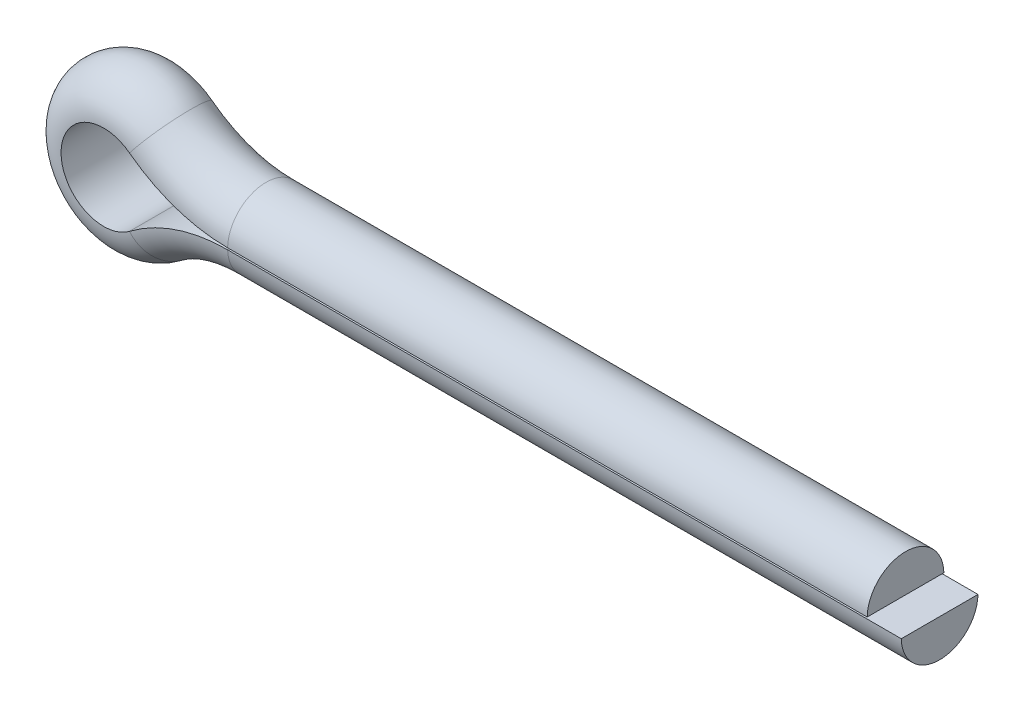
ISO-10303-21;
HEADER;
FILE_DESCRIPTION(('STEP AP214'),'2;1');
FILE_NAME('part.step','',(''),(''),'','','');
FILE_SCHEMA(('AUTOMOTIVE_DESIGN { 1 0 10303 214 1 1 1 1 }'));
ENDSEC;
DATA;
#1=APPLICATION_CONTEXT('core data for automotive mechanical design processes');
#2=APPLICATION_PROTOCOL_DEFINITION('international standard','automotive_design',2000,#1);
#3=PRODUCT_CONTEXT('',#1,'mechanical');
#4=PRODUCT('Part','Part','',(#3));
#5=PRODUCT_RELATED_PRODUCT_CATEGORY('part','',(#4));
#6=PRODUCT_DEFINITION_FORMATION('','',#4);
#7=PRODUCT_DEFINITION_CONTEXT('part definition',#1,'design');
#8=PRODUCT_DEFINITION('design','',#6,#7);
#9=PRODUCT_DEFINITION_SHAPE('','',#8);
#10=(LENGTH_UNIT() NAMED_UNIT(*) SI_UNIT(.MILLI.,.METRE.));
#11=(NAMED_UNIT(*) PLANE_ANGLE_UNIT() SI_UNIT($,.RADIAN.));
#12=(NAMED_UNIT(*) SI_UNIT($,.STERADIAN.) SOLID_ANGLE_UNIT());
#13=UNCERTAINTY_MEASURE_WITH_UNIT(LENGTH_MEASURE(1.E-05),#10,'distance_accuracy_value','');
#14=(GEOMETRIC_REPRESENTATION_CONTEXT(3) GLOBAL_UNCERTAINTY_ASSIGNED_CONTEXT((#13)) GLOBAL_UNIT_ASSIGNED_CONTEXT((#10,
#11,#12)) REPRESENTATION_CONTEXT('',''));
#15=CARTESIAN_POINT('',(0.,0.,0.));
#16=DIRECTION('',(0.,0.,1.));
#17=DIRECTION('',(1.,0.,0.));
#18=AXIS2_PLACEMENT_3D('',#15,#16,#17);
#19=CARTESIAN_POINT('',(0.,0.,0.));
#20=DIRECTION('',(1.,0.,0.));
#21=DIRECTION('',(0.,0.,-1.));
#22=AXIS2_PLACEMENT_3D('',#19,#20,#21);
#23=PLANE('',#22);
#24=CARTESIAN_POINT('',(0.,0.,0.));
#25=DIRECTION('',(1.,0.,0.));
#26=DIRECTION('',(0.,0.,-1.));
#27=AXIS2_PLACEMENT_3D('',#24,#25,#26);
#28=CIRCLE('',#27,1.143);
#29=CARTESIAN_POINT('',(0.,0.0253999999999999,-1.14271774292692));
#30=VERTEX_POINT('',#29);
#31=CARTESIAN_POINT('',(0.,0.0254,1.14271774292692));
#32=VERTEX_POINT('',#31);
#33=EDGE_CURVE('E88',#30,#32,#28,.T.);
#34=ORIENTED_EDGE('',*,*,#33,.T.);
#35=DIRECTION('',(0.,0.,-1.));
#36=VECTOR('',#35,1.);
#37=CARTESIAN_POINT('',(0.,0.0254,1.14271774292692));
#38=LINE('',#37,#36);
#39=EDGE_CURVE('E97',#32,#30,#38,.T.);
#40=ORIENTED_EDGE('',*,*,#39,.T.);
#41=EDGE_LOOP('',(#34,#40));
#42=FACE_BOUND('',#41,.T.);
#43=ADVANCED_FACE('F37',(#42),#23,.T.);
#44=CARTESIAN_POINT('',(1.01599999999998,0.,0.));
#45=DIRECTION('',(-1.,0.,0.));
#46=DIRECTION('',(0.,0.,-1.));
#47=AXIS2_PLACEMENT_3D('',#44,#45,#46);
#48=PLANE('',#47);
#49=CARTESIAN_POINT('',(1.01599999999998,0.,0.));
#50=DIRECTION('',(-1.,0.,0.));
#51=DIRECTION('',(0.,0.,-1.));
#52=AXIS2_PLACEMENT_3D('',#49,#50,#51);
#53=CIRCLE('',#52,1.143);
#54=CARTESIAN_POINT('',(1.01599999999998,-0.0253999999999999,-1.14271774292692));
#55=VERTEX_POINT('',#54);
#56=CARTESIAN_POINT('',(1.01599999999998,-0.0254,1.14271774292692));
#57=VERTEX_POINT('',#56);
#58=EDGE_CURVE('E51',#55,#57,#53,.T.);
#59=ORIENTED_EDGE('',*,*,#58,.F.);
#60=DIRECTION('',(0.,0.,-1.));
#61=VECTOR('',#60,1.);
#62=CARTESIAN_POINT('',(1.01599999999998,-0.0254,1.14271774292692));
#63=LINE('',#62,#61);
#64=EDGE_CURVE('E11',#57,#55,#63,.T.);
#65=ORIENTED_EDGE('',*,*,#64,.F.);
#66=EDGE_LOOP('',(#59,#65));
#67=FACE_BOUND('',#66,.T.);
#68=ADVANCED_FACE('F188',(#67),#48,.F.);
#69=CARTESIAN_POINT('',(0.,0.,0.));
#70=DIRECTION('',(-1.,0.,0.));
#71=DIRECTION('',(0.,-1.,0.));
#72=AXIS2_PLACEMENT_3D('',#69,#70,#71);
#73=CYLINDRICAL_SURFACE('',#72,1.143);
#74=DIRECTION('',(-1.,0.,0.));
#75=VECTOR('',#74,1.);
#76=CARTESIAN_POINT('',(0.,0.0254,1.14271774292692));
#77=LINE('',#76,#75);
#78=CARTESIAN_POINT('',(-19.05,0.0253999999999949,1.14271774292692));
#79=VERTEX_POINT('',#78);
#80=EDGE_CURVE('E95',#32,#79,#77,.T.);
#81=ORIENTED_EDGE('',*,*,#80,.F.);
#82=ORIENTED_EDGE('',*,*,#33,.F.);
#83=DIRECTION('',(-1.,0.,0.));
#84=VECTOR('',#83,1.);
#85=CARTESIAN_POINT('',(0.,0.0253999999999999,-1.14271774292692));
#86=LINE('',#85,#84);
#87=CARTESIAN_POINT('',(-19.05,0.0253999999999948,-1.14271774292692));
#88=VERTEX_POINT('',#87);
#89=EDGE_CURVE('E93',#30,#88,#86,.T.);
#90=ORIENTED_EDGE('',*,*,#89,.T.);
#91=CARTESIAN_POINT('',(-19.05,0.,0.));
#92=DIRECTION('',(1.,0.,0.));
#93=DIRECTION('',(0.,0.,-1.));
#94=AXIS2_PLACEMENT_3D('',#91,#92,#93);
#95=CIRCLE('',#94,1.143);
#96=EDGE_CURVE('E106',#88,#79,#95,.T.);
#97=ORIENTED_EDGE('',*,*,#96,.T.);
#98=EDGE_LOOP('',(#81,#82,#90,#97));
#99=FACE_BOUND('',#98,.T.);
#100=ADVANCED_FACE('F90',(#99),#73,.T.);
#101=CARTESIAN_POINT('',(0.,0.0254,1.14271774292692));
#102=DIRECTION('',(0.,1.,0.));
#103=DIRECTION('',(-1.,0.,0.));
#104=AXIS2_PLACEMENT_3D('',#101,#102,#103);
#105=PLANE('',#104);
#106=DIRECTION('',(0.,0.,-1.));
#107=VECTOR('',#106,1.);
#108=CARTESIAN_POINT('',(-19.05,0.0253999999999949,1.14271774292692));
#109=LINE('',#108,#107);
#110=EDGE_CURVE('E104',#79,#88,#109,.T.);
#111=ORIENTED_EDGE('',*,*,#110,.T.);
#112=ORIENTED_EDGE('',*,*,#89,.F.);
#113=ORIENTED_EDGE('',*,*,#39,.F.);
#114=ORIENTED_EDGE('',*,*,#80,.T.);
#115=EDGE_LOOP('',(#111,#112,#113,#114));
#116=FACE_BOUND('',#115,.T.);
#117=ADVANCED_FACE('F102',(#116),#105,.F.);
#118=CARTESIAN_POINT('',(-19.05,4.8514,0.));
#119=DIRECTION('',(0.,0.,-1.));
#120=DIRECTION('',(-1.,0.,0.));
#121=AXIS2_PLACEMENT_3D('',#118,#119,#120);
#122=TOROIDAL_SURFACE('',#121,4.8514,1.143);
#123=CARTESIAN_POINT('',(-19.05,4.8514,1.14271774292692));
#124=DIRECTION('',(0.,0.,-1.));
#125=DIRECTION('',(0.,-1.,0.));
#126=AXIS2_PLACEMENT_3D('',#123,#124,#125);
#127=CIRCLE('',#126,4.826);
#128=CARTESIAN_POINT('',(-21.9722189379986,1.01070833333334,1.14271774292692));
#129=VERTEX_POINT('',#128);
#130=EDGE_CURVE('E114',#79,#129,#127,.T.);
#131=ORIENTED_EDGE('',*,*,#130,.F.);
#132=ORIENTED_EDGE('',*,*,#96,.F.);
#133=CARTESIAN_POINT('',(-19.05,4.8514,-1.14271774292692));
#134=DIRECTION('',(0.,0.,-1.));
#135=DIRECTION('',(0.,-1.,0.));
#136=AXIS2_PLACEMENT_3D('',#133,#134,#135);
#137=CIRCLE('',#136,4.826);
#138=CARTESIAN_POINT('',(-21.9722189379986,1.01070833333334,-1.14271774292692));
#139=VERTEX_POINT('',#138);
#140=EDGE_CURVE('E115',#88,#139,#137,.T.);
#141=ORIENTED_EDGE('',*,*,#140,.T.);
#142=CARTESIAN_POINT('',(-21.9875990376722,0.990494166666675,0.));
#143=DIRECTION('',(0.79583333333333,-0.605515735184116,0.));
#144=DIRECTION('',(0.,0.,-1.));
#145=AXIS2_PLACEMENT_3D('',#142,#143,#144);
#146=CIRCLE('',#145,1.143);
#147=EDGE_CURVE('E111',#139,#129,#146,.T.);
#148=ORIENTED_EDGE('',*,*,#147,.T.);
#149=EDGE_LOOP('',(#131,#132,#141,#148));
#150=FACE_BOUND('',#149,.T.);
#151=ADVANCED_FACE('F168',(#150),#122,.T.);
#152=CARTESIAN_POINT('',(-19.05,4.8514,0.));
#153=DIRECTION('',(0.,0.,-1.));
#154=DIRECTION('',(-1.,0.,0.));
#155=AXIS2_PLACEMENT_3D('',#152,#153,#154);
#156=CYLINDRICAL_SURFACE('',#155,4.826);
#157=DIRECTION('',(0.,0.,-1.));
#158=VECTOR('',#157,1.);
#159=CARTESIAN_POINT('',(-21.9722189379986,1.01070833333334,1.14271774292692));
#160=LINE('',#159,#158);
#161=EDGE_CURVE('E118',#129,#139,#160,.T.);
#162=ORIENTED_EDGE('',*,*,#161,.T.);
#163=ORIENTED_EDGE('',*,*,#140,.F.);
#164=ORIENTED_EDGE('',*,*,#110,.F.);
#165=ORIENTED_EDGE('',*,*,#130,.T.);
#166=EDGE_LOOP('',(#162,#163,#164,#165));
#167=FACE_BOUND('',#166,.T.);
#168=ADVANCED_FACE('F166',(#167),#156,.T.);
#169=CARTESIAN_POINT('',(-22.7412239216824,0.,0.));
#170=DIRECTION('',(0.,0.,1.));
#171=DIRECTION('',(1.,0.,0.));
#172=AXIS2_PLACEMENT_3D('',#169,#170,#171);
#173=TOROIDAL_SURFACE('',#172,1.2446,1.143);
#174=CARTESIAN_POINT('',(-22.7412239216824,0.,1.14271774292692));
#175=DIRECTION('',(0.,0.,1.));
#176=DIRECTION('',(0.605515735184106,0.795833333333338,0.));
#177=AXIS2_PLACEMENT_3D('',#174,#175,#176);
#178=CIRCLE('',#177,1.27);
#179=CARTESIAN_POINT('',(-21.9722189379986,-1.01070833333333,1.14271774292692));
#180=VERTEX_POINT('',#179);
#181=EDGE_CURVE('E124',#129,#180,#178,.T.);
#182=ORIENTED_EDGE('',*,*,#181,.F.);
#183=ORIENTED_EDGE('',*,*,#147,.F.);
#184=CARTESIAN_POINT('',(-22.7412239216824,0.,-1.14271774292692));
#185=DIRECTION('',(0.,0.,1.));
#186=DIRECTION('',(0.605515735184106,0.795833333333338,0.));
#187=AXIS2_PLACEMENT_3D('',#184,#185,#186);
#188=CIRCLE('',#187,1.27);
#189=CARTESIAN_POINT('',(-21.9722189379986,-1.01070833333333,-1.14271774292692));
#190=VERTEX_POINT('',#189);
#191=EDGE_CURVE('E125',#139,#190,#188,.T.);
#192=ORIENTED_EDGE('',*,*,#191,.T.);
#193=CARTESIAN_POINT('',(-21.9875990376722,-0.990494166666666,0.));
#194=DIRECTION('',(-0.795833333333334,-0.605515735184111,0.));
#195=DIRECTION('',(0.,0.,-1.));
#196=AXIS2_PLACEMENT_3D('',#193,#194,#195);
#197=CIRCLE('',#196,1.143);
#198=EDGE_CURVE('E121',#190,#180,#197,.T.);
#199=ORIENTED_EDGE('',*,*,#198,.T.);
#200=EDGE_LOOP('',(#182,#183,#192,#199));
#201=FACE_BOUND('',#200,.T.);
#202=ADVANCED_FACE('F161',(#201),#173,.T.);
#203=CARTESIAN_POINT('',(-22.7412239216824,0.,0.));
#204=DIRECTION('',(0.,0.,1.));
#205=DIRECTION('',(1.,0.,0.));
#206=AXIS2_PLACEMENT_3D('',#203,#204,#205);
#207=CYLINDRICAL_SURFACE('',#206,1.27);
#208=DIRECTION('',(0.,0.,-1.));
#209=VECTOR('',#208,1.);
#210=CARTESIAN_POINT('',(-21.9722189379986,-1.01070833333333,1.14271774292692));
#211=LINE('',#210,#209);
#212=EDGE_CURVE('E128',#180,#190,#211,.T.);
#213=ORIENTED_EDGE('',*,*,#212,.T.);
#214=ORIENTED_EDGE('',*,*,#191,.F.);
#215=ORIENTED_EDGE('',*,*,#161,.F.);
#216=ORIENTED_EDGE('',*,*,#181,.T.);
#217=EDGE_LOOP('',(#213,#214,#215,#216));
#218=FACE_BOUND('',#217,.T.);
#219=ADVANCED_FACE('F164',(#218),#207,.F.);
#220=CARTESIAN_POINT('',(-19.05,-4.8514,0.));
#221=DIRECTION('',(0.,0.,-1.));
#222=DIRECTION('',(-1.,0.,0.));
#223=AXIS2_PLACEMENT_3D('',#220,#221,#222);
#224=TOROIDAL_SURFACE('',#223,4.8514,1.143);
#225=CARTESIAN_POINT('',(-19.05,-4.8514,1.14271774292692));
#226=DIRECTION('',(0.,0.,-1.));
#227=DIRECTION('',(-0.605515735184111,0.795833333333334,0.));
#228=AXIS2_PLACEMENT_3D('',#225,#226,#227);
#229=CIRCLE('',#228,4.826);
#230=CARTESIAN_POINT('',(-19.05,-0.0254000000000035,1.14271774292692));
#231=VERTEX_POINT('',#230);
#232=EDGE_CURVE('E134',#180,#231,#229,.T.);
#233=ORIENTED_EDGE('',*,*,#232,.F.);
#234=ORIENTED_EDGE('',*,*,#198,.F.);
#235=CARTESIAN_POINT('',(-19.05,-4.8514,-1.14271774292692));
#236=DIRECTION('',(0.,0.,-1.));
#237=DIRECTION('',(-0.605515735184111,0.795833333333334,0.));
#238=AXIS2_PLACEMENT_3D('',#235,#236,#237);
#239=CIRCLE('',#238,4.826);
#240=CARTESIAN_POINT('',(-19.05,-0.0254000000000035,-1.14271774292692));
#241=VERTEX_POINT('',#240);
#242=EDGE_CURVE('E135',#190,#241,#239,.T.);
#243=ORIENTED_EDGE('',*,*,#242,.T.);
#244=CARTESIAN_POINT('',(-19.05,0.,0.));
#245=DIRECTION('',(-1.,0.,0.));
#246=DIRECTION('',(0.,0.,-1.));
#247=AXIS2_PLACEMENT_3D('',#244,#245,#246);
#248=CIRCLE('',#247,1.143);
#249=EDGE_CURVE('E131',#241,#231,#248,.T.);
#250=ORIENTED_EDGE('',*,*,#249,.T.);
#251=EDGE_LOOP('',(#233,#234,#243,#250));
#252=FACE_BOUND('',#251,.T.);
#253=ADVANCED_FACE('F158',(#252),#224,.T.);
#254=CARTESIAN_POINT('',(-19.05,-4.8514,0.));
#255=DIRECTION('',(0.,0.,-1.));
#256=DIRECTION('',(-1.,0.,0.));
#257=AXIS2_PLACEMENT_3D('',#254,#255,#256);
#258=CYLINDRICAL_SURFACE('',#257,4.826);
#259=DIRECTION('',(0.,0.,-1.));
#260=VECTOR('',#259,1.);
#261=CARTESIAN_POINT('',(-19.05,-0.0254000000000018,1.14271774292692));
#262=LINE('',#261,#260);
#263=EDGE_CURVE('E138',#231,#241,#262,.T.);
#264=ORIENTED_EDGE('',*,*,#263,.T.);
#265=ORIENTED_EDGE('',*,*,#242,.F.);
#266=ORIENTED_EDGE('',*,*,#212,.F.);
#267=ORIENTED_EDGE('',*,*,#232,.T.);
#268=EDGE_LOOP('',(#264,#265,#266,#267));
#269=FACE_BOUND('',#268,.T.);
#270=ADVANCED_FACE('F153',(#269),#258,.T.);
#271=CARTESIAN_POINT('',(-19.05,0.,0.));
#272=DIRECTION('',(1.,0.,0.));
#273=DIRECTION('',(0.,1.,0.));
#274=AXIS2_PLACEMENT_3D('',#271,#272,#273);
#275=CYLINDRICAL_SURFACE('',#274,1.143);
#276=DIRECTION('',(1.,0.,0.));
#277=VECTOR('',#276,1.);
#278=CARTESIAN_POINT('',(-19.05,-0.0254000000000001,1.14271774292692));
#279=LINE('',#278,#277);
#280=EDGE_CURVE('E44',#231,#57,#279,.T.);
#281=ORIENTED_EDGE('',*,*,#280,.F.);
#282=ORIENTED_EDGE('',*,*,#249,.F.);
#283=DIRECTION('',(1.,0.,0.));
#284=VECTOR('',#283,1.);
#285=CARTESIAN_POINT('',(-19.05,-0.0254,-1.14271774292692));
#286=LINE('',#285,#284);
#287=EDGE_CURVE('E142',#241,#55,#286,.T.);
#288=ORIENTED_EDGE('',*,*,#287,.T.);
#289=ORIENTED_EDGE('',*,*,#58,.T.);
#290=EDGE_LOOP('',(#281,#282,#288,#289));
#291=FACE_BOUND('',#290,.T.);
#292=ADVANCED_FACE('F155',(#291),#275,.T.);
#293=CARTESIAN_POINT('',(-19.05,-0.0254000000000001,1.14271774292692));
#294=DIRECTION('',(0.,-1.,0.));
#295=DIRECTION('',(0.,0.,-1.));
#296=AXIS2_PLACEMENT_3D('',#293,#294,#295);
#297=PLANE('',#296);
#298=ORIENTED_EDGE('',*,*,#64,.T.);
#299=ORIENTED_EDGE('',*,*,#287,.F.);
#300=ORIENTED_EDGE('',*,*,#263,.F.);
#301=ORIENTED_EDGE('',*,*,#280,.T.);
#302=EDGE_LOOP('',(#298,#299,#300,#301));
#303=FACE_BOUND('',#302,.T.);
#304=ADVANCED_FACE('F179',(#303),#297,.F.);
#305=CLOSED_SHELL('',(#43,#68,#100,#117,#151,#168,#202,#219,#253,#270,#292,#304));
#306=MANIFOLD_SOLID_BREP('B2',#305);
#307=ADVANCED_BREP_SHAPE_REPRESENTATION('',(#18,#306),#14);
#308=SHAPE_DEFINITION_REPRESENTATION(#9,#307);
ENDSEC;
END-ISO-10303-21;
